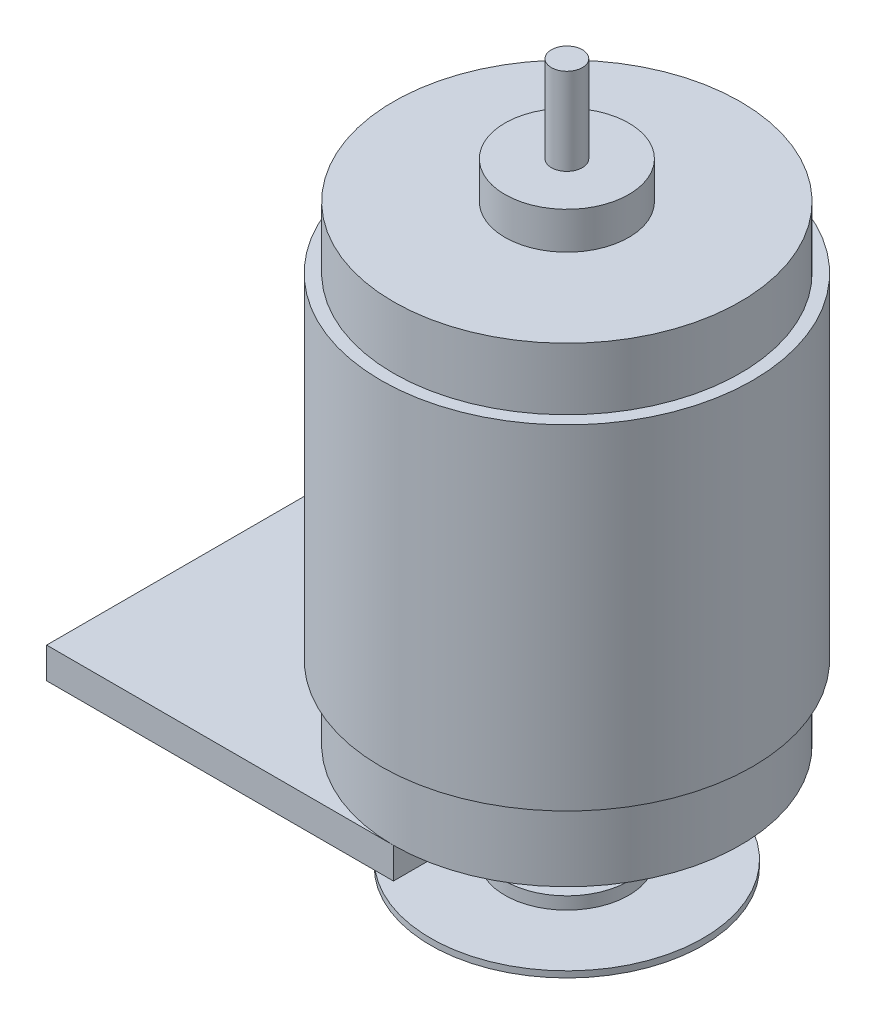
ISO-10303-21;
HEADER;
FILE_DESCRIPTION(('STEP AP214'),'2;1');
FILE_NAME('part.step','',(''),(''),'','','');
FILE_SCHEMA(('AUTOMOTIVE_DESIGN { 1 0 10303 214 1 1 1 1 }'));
ENDSEC;
DATA;
#1=APPLICATION_CONTEXT('core data for automotive mechanical design processes');
#2=APPLICATION_PROTOCOL_DEFINITION('international standard','automotive_design',2000,#1);
#3=PRODUCT_CONTEXT('',#1,'mechanical');
#4=PRODUCT('Part','Part','',(#3));
#5=PRODUCT_RELATED_PRODUCT_CATEGORY('part','',(#4));
#6=PRODUCT_DEFINITION_FORMATION('','',#4);
#7=PRODUCT_DEFINITION_CONTEXT('part definition',#1,'design');
#8=PRODUCT_DEFINITION('design','',#6,#7);
#9=PRODUCT_DEFINITION_SHAPE('','',#8);
#10=(LENGTH_UNIT() NAMED_UNIT(*) SI_UNIT(.MILLI.,.METRE.));
#11=(NAMED_UNIT(*) PLANE_ANGLE_UNIT() SI_UNIT($,.RADIAN.));
#12=(NAMED_UNIT(*) SI_UNIT($,.STERADIAN.) SOLID_ANGLE_UNIT());
#13=UNCERTAINTY_MEASURE_WITH_UNIT(LENGTH_MEASURE(1.E-05),#10,'distance_accuracy_value','');
#14=(GEOMETRIC_REPRESENTATION_CONTEXT(3) GLOBAL_UNCERTAINTY_ASSIGNED_CONTEXT((#13)) GLOBAL_UNIT_ASSIGNED_CONTEXT((#10,
#11,#12)) REPRESENTATION_CONTEXT('',''));
#15=CARTESIAN_POINT('',(0.,0.,0.));
#16=DIRECTION('',(0.,0.,1.));
#17=DIRECTION('',(1.,0.,0.));
#18=AXIS2_PLACEMENT_3D('',#15,#16,#17);
#19=CARTESIAN_POINT('',(0.,-6.,0.));
#20=DIRECTION('',(0.,-1.,0.));
#21=DIRECTION('',(0.,0.,-1.));
#22=AXIS2_PLACEMENT_3D('',#19,#20,#21);
#23=PLANE('',#22);
#24=CARTESIAN_POINT('',(0.,-6.,0.));
#25=DIRECTION('',(0.,-1.,0.));
#26=DIRECTION('',(0.,0.,-1.));
#27=AXIS2_PLACEMENT_3D('',#24,#25,#26);
#28=CIRCLE('',#27,14.);
#29=CARTESIAN_POINT('',(0.,-6.,-14.));
#30=VERTEX_POINT('',#29);
#31=CARTESIAN_POINT('',(0.,-6.,14.));
#32=VERTEX_POINT('',#31);
#33=EDGE_CURVE('E139',#30,#32,#28,.T.);
#34=ORIENTED_EDGE('',*,*,#33,.T.);
#35=DIRECTION('',(0.,0.,1.));
#36=VECTOR('',#35,1.);
#37=CARTESIAN_POINT('',(0.,-6.,14.));
#38=LINE('',#37,#36);
#39=CARTESIAN_POINT('',(0.,-6.,5.));
#40=VERTEX_POINT('',#39);
#41=EDGE_CURVE('E128',#40,#32,#38,.T.);
#42=ORIENTED_EDGE('',*,*,#41,.F.);
#43=CARTESIAN_POINT('',(0.,-6.,0.));
#44=DIRECTION('',(0.,-1.,0.));
#45=DIRECTION('',(0.,0.,-1.));
#46=AXIS2_PLACEMENT_3D('',#43,#44,#45);
#47=CIRCLE('',#46,5.);
#48=CARTESIAN_POINT('',(0.,-6.,-5.));
#49=VERTEX_POINT('',#48);
#50=EDGE_CURVE('E140',#49,#40,#47,.T.);
#51=ORIENTED_EDGE('',*,*,#50,.F.);
#52=EDGE_CURVE('E71',#30,#49,#38,.T.);
#53=ORIENTED_EDGE('',*,*,#52,.F.);
#54=EDGE_LOOP('',(#34,#42,#51,#53));
#55=FACE_BOUND('',#54,.T.);
#56=ADVANCED_FACE('F48',(#55),#23,.T.);
#57=CARTESIAN_POINT('',(0.,-9.,0.));
#58=DIRECTION('',(0.,1.,0.));
#59=DIRECTION('',(0.,0.,1.));
#60=AXIS2_PLACEMENT_3D('',#57,#58,#59);
#61=CYLINDRICAL_SURFACE('',#60,5.);
#62=CARTESIAN_POINT('',(0.,-9.,0.));
#63=DIRECTION('',(0.,-1.,0.));
#64=DIRECTION('',(0.,0.,-1.));
#65=AXIS2_PLACEMENT_3D('',#62,#63,#64);
#66=CIRCLE('',#65,5.);
#67=CARTESIAN_POINT('',(0.,-9.,-5.));
#68=VERTEX_POINT('',#67);
#69=EDGE_CURVE('E131',#68,#68,#66,.T.);
#70=ORIENTED_EDGE('',*,*,#69,.F.);
#71=EDGE_LOOP('',(#70));
#72=FACE_BOUND('',#71,.T.);
#73=DIRECTION('',(0.,1.,0.));
#74=VECTOR('',#73,1.);
#75=CARTESIAN_POINT('',(0.,-9.,5.));
#76=LINE('',#75,#74);
#77=CARTESIAN_POINT('',(0.,-8.5,5.));
#78=VERTEX_POINT('',#77);
#79=EDGE_CURVE('E52',#78,#40,#76,.T.);
#80=ORIENTED_EDGE('',*,*,#79,.F.);
#81=CARTESIAN_POINT('',(0.,-8.5,0.));
#82=DIRECTION('',(0.,1.,0.));
#83=DIRECTION('',(0.,0.,1.));
#84=AXIS2_PLACEMENT_3D('',#81,#82,#83);
#85=CIRCLE('',#84,5.);
#86=CARTESIAN_POINT('',(0.,-8.5,-5.));
#87=VERTEX_POINT('',#86);
#88=EDGE_CURVE('E110',#87,#78,#85,.T.);
#89=ORIENTED_EDGE('',*,*,#88,.F.);
#90=DIRECTION('',(0.,1.,0.));
#91=VECTOR('',#90,1.);
#92=CARTESIAN_POINT('',(0.,-9.,-5.));
#93=LINE('',#92,#91);
#94=EDGE_CURVE('E171',#49,#87,#93,.F.);
#95=ORIENTED_EDGE('',*,*,#94,.F.);
#96=ORIENTED_EDGE('',*,*,#50,.T.);
#97=EDGE_LOOP('',(#80,#89,#95,#96));
#98=FACE_BOUND('',#97,.T.);
#99=ADVANCED_FACE('F221',(#72,#98),#61,.T.);
#100=CARTESIAN_POINT('',(0.,27.,0.));
#101=DIRECTION('',(0.,-1.,0.));
#102=DIRECTION('',(0.,0.,-1.));
#103=AXIS2_PLACEMENT_3D('',#100,#101,#102);
#104=CYLINDRICAL_SURFACE('',#103,15.);
#105=CARTESIAN_POINT('',(0.,27.,0.));
#106=DIRECTION('',(0.,1.,0.));
#107=DIRECTION('',(0.,0.,1.));
#108=AXIS2_PLACEMENT_3D('',#105,#106,#107);
#109=CIRCLE('',#108,15.);
#110=CARTESIAN_POINT('',(0.,27.,15.));
#111=VERTEX_POINT('',#110);
#112=EDGE_CURVE('E166',#111,#111,#109,.T.);
#113=ORIENTED_EDGE('',*,*,#112,.F.);
#114=EDGE_LOOP('',(#113));
#115=FACE_BOUND('',#114,.T.);
#116=CARTESIAN_POINT('',(0.,0.,0.));
#117=DIRECTION('',(0.,1.,0.));
#118=DIRECTION('',(0.,0.,1.));
#119=AXIS2_PLACEMENT_3D('',#116,#117,#118);
#120=CIRCLE('',#119,15.);
#121=CARTESIAN_POINT('',(0.,0.,15.));
#122=VERTEX_POINT('',#121);
#123=EDGE_CURVE('E163',#122,#122,#120,.T.);
#124=ORIENTED_EDGE('',*,*,#123,.T.);
#125=EDGE_LOOP('',(#124));
#126=FACE_BOUND('',#125,.T.);
#127=ADVANCED_FACE('F50',(#115,#126),#104,.T.);
#128=CARTESIAN_POINT('',(0.,27.,0.));
#129=DIRECTION('',(0.,1.,0.));
#130=DIRECTION('',(0.,0.,1.));
#131=AXIS2_PLACEMENT_3D('',#128,#129,#130);
#132=PLANE('',#131);
#133=CARTESIAN_POINT('',(0.,27.,0.));
#134=DIRECTION('',(0.,1.,0.));
#135=DIRECTION('',(0.,0.,1.));
#136=AXIS2_PLACEMENT_3D('',#133,#134,#135);
#137=CIRCLE('',#136,14.);
#138=CARTESIAN_POINT('',(0.,27.,14.));
#139=VERTEX_POINT('',#138);
#140=EDGE_CURVE('E160',#139,#139,#137,.T.);
#141=ORIENTED_EDGE('',*,*,#140,.F.);
#142=EDGE_LOOP('',(#141));
#143=FACE_BOUND('',#142,.T.);
#144=ORIENTED_EDGE('',*,*,#112,.T.);
#145=EDGE_LOOP('',(#144));
#146=FACE_BOUND('',#145,.T.);
#147=ADVANCED_FACE('F257',(#143,#146),#132,.T.);
#148=CARTESIAN_POINT('',(0.,0.,0.));
#149=DIRECTION('',(0.,1.,0.));
#150=DIRECTION('',(0.,0.,1.));
#151=AXIS2_PLACEMENT_3D('',#148,#149,#150);
#152=PLANE('',#151);
#153=CARTESIAN_POINT('',(0.,0.,0.));
#154=DIRECTION('',(0.,-1.,0.));
#155=DIRECTION('',(0.,0.,-1.));
#156=AXIS2_PLACEMENT_3D('',#153,#154,#155);
#157=CIRCLE('',#156,14.);
#158=CARTESIAN_POINT('',(0.,0.,-14.));
#159=VERTEX_POINT('',#158);
#160=EDGE_CURVE('E143',#159,#159,#157,.T.);
#161=ORIENTED_EDGE('',*,*,#160,.F.);
#162=EDGE_LOOP('',(#161));
#163=FACE_BOUND('',#162,.T.);
#164=ORIENTED_EDGE('',*,*,#123,.F.);
#165=EDGE_LOOP('',(#164));
#166=FACE_BOUND('',#165,.T.);
#167=ADVANCED_FACE('F255',(#163,#166),#152,.F.);
#168=CARTESIAN_POINT('',(0.,32.,0.));
#169=DIRECTION('',(0.,-1.,0.));
#170=DIRECTION('',(0.,0.,-1.));
#171=AXIS2_PLACEMENT_3D('',#168,#169,#170);
#172=CYLINDRICAL_SURFACE('',#171,14.);
#173=CARTESIAN_POINT('',(0.,32.,0.));
#174=DIRECTION('',(0.,1.,0.));
#175=DIRECTION('',(0.,0.,1.));
#176=AXIS2_PLACEMENT_3D('',#173,#174,#175);
#177=CIRCLE('',#176,14.);
#178=CARTESIAN_POINT('',(0.,32.,14.));
#179=VERTEX_POINT('',#178);
#180=EDGE_CURVE('E157',#179,#179,#177,.T.);
#181=ORIENTED_EDGE('',*,*,#180,.F.);
#182=EDGE_LOOP('',(#181));
#183=FACE_BOUND('',#182,.T.);
#184=ORIENTED_EDGE('',*,*,#140,.T.);
#185=EDGE_LOOP('',(#184));
#186=FACE_BOUND('',#185,.T.);
#187=ADVANCED_FACE('F251',(#183,#186),#172,.T.);
#188=CARTESIAN_POINT('',(0.,32.,0.));
#189=DIRECTION('',(0.,1.,0.));
#190=DIRECTION('',(0.,0.,1.));
#191=AXIS2_PLACEMENT_3D('',#188,#189,#190);
#192=PLANE('',#191);
#193=CARTESIAN_POINT('',(0.,32.,0.));
#194=DIRECTION('',(0.,1.,0.));
#195=DIRECTION('',(0.,0.,1.));
#196=AXIS2_PLACEMENT_3D('',#193,#194,#195);
#197=CIRCLE('',#196,5.);
#198=CARTESIAN_POINT('',(0.,32.,5.));
#199=VERTEX_POINT('',#198);
#200=EDGE_CURVE('E154',#199,#199,#197,.T.);
#201=ORIENTED_EDGE('',*,*,#200,.F.);
#202=EDGE_LOOP('',(#201));
#203=FACE_BOUND('',#202,.T.);
#204=ORIENTED_EDGE('',*,*,#180,.T.);
#205=EDGE_LOOP('',(#204));
#206=FACE_BOUND('',#205,.T.);
#207=ADVANCED_FACE('F247',(#203,#206),#192,.T.);
#208=CARTESIAN_POINT('',(0.,35.,0.));
#209=DIRECTION('',(0.,-1.,0.));
#210=DIRECTION('',(0.,0.,-1.));
#211=AXIS2_PLACEMENT_3D('',#208,#209,#210);
#212=CYLINDRICAL_SURFACE('',#211,5.);
#213=CARTESIAN_POINT('',(0.,35.,0.));
#214=DIRECTION('',(0.,1.,0.));
#215=DIRECTION('',(0.,0.,1.));
#216=AXIS2_PLACEMENT_3D('',#213,#214,#215);
#217=CIRCLE('',#216,5.);
#218=CARTESIAN_POINT('',(0.,35.,5.));
#219=VERTEX_POINT('',#218);
#220=EDGE_CURVE('E151',#219,#219,#217,.T.);
#221=ORIENTED_EDGE('',*,*,#220,.F.);
#222=EDGE_LOOP('',(#221));
#223=FACE_BOUND('',#222,.T.);
#224=ORIENTED_EDGE('',*,*,#200,.T.);
#225=EDGE_LOOP('',(#224));
#226=FACE_BOUND('',#225,.T.);
#227=ADVANCED_FACE('F243',(#223,#226),#212,.T.);
#228=CARTESIAN_POINT('',(0.,35.,0.));
#229=DIRECTION('',(0.,1.,0.));
#230=DIRECTION('',(0.,0.,1.));
#231=AXIS2_PLACEMENT_3D('',#228,#229,#230);
#232=PLANE('',#231);
#233=CARTESIAN_POINT('',(0.,35.,0.));
#234=DIRECTION('',(0.,1.,0.));
#235=DIRECTION('',(0.,0.,1.));
#236=AXIS2_PLACEMENT_3D('',#233,#234,#235);
#237=CIRCLE('',#236,1.25);
#238=CARTESIAN_POINT('',(0.,35.,1.25));
#239=VERTEX_POINT('',#238);
#240=EDGE_CURVE('E148',#239,#239,#237,.T.);
#241=ORIENTED_EDGE('',*,*,#240,.F.);
#242=EDGE_LOOP('',(#241));
#243=FACE_BOUND('',#242,.T.);
#244=ORIENTED_EDGE('',*,*,#220,.T.);
#245=EDGE_LOOP('',(#244));
#246=FACE_BOUND('',#245,.T.);
#247=ADVANCED_FACE('F239',(#243,#246),#232,.T.);
#248=CARTESIAN_POINT('',(0.,42.,0.));
#249=DIRECTION('',(0.,-1.,0.));
#250=DIRECTION('',(0.,0.,-1.));
#251=AXIS2_PLACEMENT_3D('',#248,#249,#250);
#252=CYLINDRICAL_SURFACE('',#251,1.25);
#253=CARTESIAN_POINT('',(0.,42.,0.));
#254=DIRECTION('',(0.,1.,0.));
#255=DIRECTION('',(0.,0.,1.));
#256=AXIS2_PLACEMENT_3D('',#253,#254,#255);
#257=CIRCLE('',#256,1.25);
#258=CARTESIAN_POINT('',(0.,42.,1.25));
#259=VERTEX_POINT('',#258);
#260=EDGE_CURVE('E145',#259,#259,#257,.T.);
#261=ORIENTED_EDGE('',*,*,#260,.F.);
#262=EDGE_LOOP('',(#261));
#263=FACE_BOUND('',#262,.T.);
#264=ORIENTED_EDGE('',*,*,#240,.T.);
#265=EDGE_LOOP('',(#264));
#266=FACE_BOUND('',#265,.T.);
#267=ADVANCED_FACE('F235',(#263,#266),#252,.T.);
#268=CARTESIAN_POINT('',(0.,42.,0.));
#269=DIRECTION('',(0.,1.,0.));
#270=DIRECTION('',(0.,0.,1.));
#271=AXIS2_PLACEMENT_3D('',#268,#269,#270);
#272=PLANE('',#271);
#273=ORIENTED_EDGE('',*,*,#260,.T.);
#274=EDGE_LOOP('',(#273));
#275=FACE_BOUND('',#274,.T.);
#276=ADVANCED_FACE('F232',(#275),#272,.T.);
#277=CARTESIAN_POINT('',(0.,-6.,0.));
#278=DIRECTION('',(0.,1.,0.));
#279=DIRECTION('',(0.,0.,1.));
#280=AXIS2_PLACEMENT_3D('',#277,#278,#279);
#281=CYLINDRICAL_SURFACE('',#280,14.);
#282=ORIENTED_EDGE('',*,*,#33,.F.);
#283=CARTESIAN_POINT('',(0.,-6.,0.));
#284=DIRECTION('',(0.,1.,0.));
#285=DIRECTION('',(0.,0.,1.));
#286=AXIS2_PLACEMENT_3D('',#283,#284,#285);
#287=CIRCLE('',#286,14.);
#288=EDGE_CURVE('E64',#30,#32,#287,.T.);
#289=ORIENTED_EDGE('',*,*,#288,.T.);
#290=EDGE_LOOP('',(#282,#289));
#291=FACE_BOUND('',#290,.T.);
#292=ORIENTED_EDGE('',*,*,#160,.T.);
#293=EDGE_LOOP('',(#292));
#294=FACE_BOUND('',#293,.T.);
#295=ADVANCED_FACE('F229',(#291,#294),#281,.T.);
#296=CARTESIAN_POINT('',(0.,-9.,0.));
#297=DIRECTION('',(0.,-1.,0.));
#298=DIRECTION('',(0.,0.,-1.));
#299=AXIS2_PLACEMENT_3D('',#296,#297,#298);
#300=PLANE('',#299);
#301=CARTESIAN_POINT('',(0.,-9.,0.));
#302=DIRECTION('',(0.,-1.,0.));
#303=DIRECTION('',(0.,0.,-1.));
#304=AXIS2_PLACEMENT_3D('',#301,#302,#303);
#305=CIRCLE('',#304,1.25);
#306=CARTESIAN_POINT('',(0.,-9.,-1.25));
#307=VERTEX_POINT('',#306);
#308=EDGE_CURVE('E175',#307,#307,#305,.T.);
#309=ORIENTED_EDGE('',*,*,#308,.F.);
#310=EDGE_LOOP('',(#309));
#311=FACE_BOUND('',#310,.T.);
#312=ORIENTED_EDGE('',*,*,#69,.T.);
#313=EDGE_LOOP('',(#312));
#314=FACE_BOUND('',#313,.T.);
#315=ADVANCED_FACE('F218',(#311,#314),#300,.T.);
#316=CARTESIAN_POINT('',(0.,-8.5,14.));
#317=DIRECTION('',(-1.,0.,0.));
#318=DIRECTION('',(0.,0.,1.));
#319=AXIS2_PLACEMENT_3D('',#316,#317,#318);
#320=PLANE('',#319);
#321=DIRECTION('',(0.,0.,1.));
#322=VECTOR('',#321,1.);
#323=CARTESIAN_POINT('',(0.,-8.5,14.));
#324=LINE('',#323,#322);
#325=CARTESIAN_POINT('',(0.,-8.5,14.));
#326=VERTEX_POINT('',#325);
#327=EDGE_CURVE('E104',#78,#326,#324,.T.);
#328=ORIENTED_EDGE('',*,*,#327,.F.);
#329=ORIENTED_EDGE('',*,*,#79,.T.);
#330=ORIENTED_EDGE('',*,*,#41,.T.);
#331=DIRECTION('',(0.,1.,0.));
#332=VECTOR('',#331,1.);
#333=CARTESIAN_POINT('',(0.,-8.5,14.));
#334=LINE('',#333,#332);
#335=EDGE_CURVE('E120',#326,#32,#334,.T.);
#336=ORIENTED_EDGE('',*,*,#335,.F.);
#337=EDGE_LOOP('',(#328,#329,#330,#336));
#338=FACE_BOUND('',#337,.T.);
#339=ADVANCED_FACE('F127',(#338),#320,.F.);
#340=ORIENTED_EDGE('',*,*,#52,.T.);
#341=ORIENTED_EDGE('',*,*,#94,.T.);
#342=CARTESIAN_POINT('',(0.,-8.5,-14.));
#343=VERTEX_POINT('',#342);
#344=EDGE_CURVE('E114',#343,#87,#324,.T.);
#345=ORIENTED_EDGE('',*,*,#344,.F.);
#346=DIRECTION('',(0.,1.,0.));
#347=VECTOR('',#346,1.);
#348=CARTESIAN_POINT('',(0.,-8.5,-14.));
#349=LINE('',#348,#347);
#350=EDGE_CURVE('E189',#343,#30,#349,.T.);
#351=ORIENTED_EDGE('',*,*,#350,.T.);
#352=EDGE_LOOP('',(#340,#341,#345,#351));
#353=FACE_BOUND('',#352,.T.);
#354=ADVANCED_FACE('F210',(#353),#320,.F.);
#355=CARTESIAN_POINT('',(0.,-8.5,14.));
#356=DIRECTION('',(0.,0.,-1.));
#357=DIRECTION('',(-1.,0.,0.));
#358=AXIS2_PLACEMENT_3D('',#355,#356,#357);
#359=PLANE('',#358);
#360=DIRECTION('',(-1.,0.,0.));
#361=VECTOR('',#360,1.);
#362=CARTESIAN_POINT('',(0.,-6.,14.));
#363=LINE('',#362,#361);
#364=CARTESIAN_POINT('',(-28.,-6.,14.));
#365=VERTEX_POINT('',#364);
#366=EDGE_CURVE('E191',#32,#365,#363,.T.);
#367=ORIENTED_EDGE('',*,*,#366,.T.);
#368=DIRECTION('',(0.,1.,0.));
#369=VECTOR('',#368,1.);
#370=CARTESIAN_POINT('',(-28.,-8.5,14.));
#371=LINE('',#370,#369);
#372=CARTESIAN_POINT('',(-28.,-8.5,14.));
#373=VERTEX_POINT('',#372);
#374=EDGE_CURVE('E122',#373,#365,#371,.T.);
#375=ORIENTED_EDGE('',*,*,#374,.F.);
#376=DIRECTION('',(-1.,0.,0.));
#377=VECTOR('',#376,1.);
#378=CARTESIAN_POINT('',(0.,-8.5,14.));
#379=LINE('',#378,#377);
#380=EDGE_CURVE('E108',#326,#373,#379,.T.);
#381=ORIENTED_EDGE('',*,*,#380,.F.);
#382=ORIENTED_EDGE('',*,*,#335,.T.);
#383=EDGE_LOOP('',(#367,#375,#381,#382));
#384=FACE_BOUND('',#383,.T.);
#385=ADVANCED_FACE('F119',(#384),#359,.F.);
#386=CARTESIAN_POINT('',(-28.,-8.5,14.));
#387=DIRECTION('',(1.,0.,0.));
#388=DIRECTION('',(0.,0.,-1.));
#389=AXIS2_PLACEMENT_3D('',#386,#387,#388);
#390=PLANE('',#389);
#391=DIRECTION('',(0.,0.,-1.));
#392=VECTOR('',#391,1.);
#393=CARTESIAN_POINT('',(-28.,-6.,14.));
#394=LINE('',#393,#392);
#395=CARTESIAN_POINT('',(-28.,-6.,-14.));
#396=VERTEX_POINT('',#395);
#397=EDGE_CURVE('E193',#365,#396,#394,.T.);
#398=ORIENTED_EDGE('',*,*,#397,.T.);
#399=DIRECTION('',(0.,1.,0.));
#400=VECTOR('',#399,1.);
#401=CARTESIAN_POINT('',(-28.,-8.5,-14.));
#402=LINE('',#401,#400);
#403=CARTESIAN_POINT('',(-28.,-8.5,-14.));
#404=VERTEX_POINT('',#403);
#405=EDGE_CURVE('E133',#404,#396,#402,.T.);
#406=ORIENTED_EDGE('',*,*,#405,.F.);
#407=DIRECTION('',(0.,0.,-1.));
#408=VECTOR('',#407,1.);
#409=CARTESIAN_POINT('',(-28.,-8.5,14.));
#410=LINE('',#409,#408);
#411=EDGE_CURVE('E124',#373,#404,#410,.T.);
#412=ORIENTED_EDGE('',*,*,#411,.F.);
#413=ORIENTED_EDGE('',*,*,#374,.T.);
#414=EDGE_LOOP('',(#398,#406,#412,#413));
#415=FACE_BOUND('',#414,.T.);
#416=ADVANCED_FACE('F209',(#415),#390,.F.);
#417=CARTESIAN_POINT('',(0.,-8.5,-14.));
#418=DIRECTION('',(0.,0.,1.));
#419=DIRECTION('',(1.,0.,0.));
#420=AXIS2_PLACEMENT_3D('',#417,#418,#419);
#421=PLANE('',#420);
#422=DIRECTION('',(1.,0.,0.));
#423=VECTOR('',#422,1.);
#424=CARTESIAN_POINT('',(0.,-6.,-14.));
#425=LINE('',#424,#423);
#426=EDGE_CURVE('E115',#396,#30,#425,.T.);
#427=ORIENTED_EDGE('',*,*,#426,.T.);
#428=ORIENTED_EDGE('',*,*,#350,.F.);
#429=DIRECTION('',(1.,0.,0.));
#430=VECTOR('',#429,1.);
#431=CARTESIAN_POINT('',(0.,-8.5,-14.));
#432=LINE('',#431,#430);
#433=EDGE_CURVE('E187',#404,#343,#432,.T.);
#434=ORIENTED_EDGE('',*,*,#433,.F.);
#435=ORIENTED_EDGE('',*,*,#405,.T.);
#436=EDGE_LOOP('',(#427,#428,#434,#435));
#437=FACE_BOUND('',#436,.T.);
#438=ADVANCED_FACE('F203',(#437),#421,.F.);
#439=CARTESIAN_POINT('',(0.,-8.5,0.));
#440=DIRECTION('',(0.,1.,0.));
#441=DIRECTION('',(0.,0.,1.));
#442=AXIS2_PLACEMENT_3D('',#439,#440,#441);
#443=PLANE('',#442);
#444=ORIENTED_EDGE('',*,*,#344,.T.);
#445=ORIENTED_EDGE('',*,*,#88,.T.);
#446=ORIENTED_EDGE('',*,*,#327,.T.);
#447=ORIENTED_EDGE('',*,*,#380,.T.);
#448=ORIENTED_EDGE('',*,*,#411,.T.);
#449=ORIENTED_EDGE('',*,*,#433,.T.);
#450=EDGE_LOOP('',(#444,#445,#446,#447,#448,#449));
#451=FACE_BOUND('',#450,.T.);
#452=ADVANCED_FACE('F107',(#451),#443,.F.);
#453=CARTESIAN_POINT('',(0.,-6.,0.));
#454=DIRECTION('',(0.,1.,0.));
#455=DIRECTION('',(0.,0.,1.));
#456=AXIS2_PLACEMENT_3D('',#453,#454,#455);
#457=PLANE('',#456);
#458=ORIENTED_EDGE('',*,*,#288,.F.);
#459=ORIENTED_EDGE('',*,*,#426,.F.);
#460=ORIENTED_EDGE('',*,*,#397,.F.);
#461=ORIENTED_EDGE('',*,*,#366,.F.);
#462=EDGE_LOOP('',(#458,#459,#460,#461));
#463=FACE_BOUND('',#462,.T.);
#464=ADVANCED_FACE('F208',(#463),#457,.T.);
#465=CARTESIAN_POINT('',(0.,-13.,0.));
#466=DIRECTION('',(0.,1.,0.));
#467=DIRECTION('',(0.,0.,1.));
#468=AXIS2_PLACEMENT_3D('',#465,#466,#467);
#469=CYLINDRICAL_SURFACE('',#468,1.25);
#470=CARTESIAN_POINT('',(0.,-13.,0.));
#471=DIRECTION('',(0.,-1.,0.));
#472=DIRECTION('',(0.,0.,-1.));
#473=AXIS2_PLACEMENT_3D('',#470,#471,#472);
#474=CIRCLE('',#473,1.25);
#475=CARTESIAN_POINT('',(0.,-13.,-1.25));
#476=VERTEX_POINT('',#475);
#477=EDGE_CURVE('E183',#476,#476,#474,.T.);
#478=ORIENTED_EDGE('',*,*,#477,.F.);
#479=EDGE_LOOP('',(#478));
#480=FACE_BOUND('',#479,.T.);
#481=ORIENTED_EDGE('',*,*,#308,.T.);
#482=EDGE_LOOP('',(#481));
#483=FACE_BOUND('',#482,.T.);
#484=ADVANCED_FACE('F385',(#480,#483),#469,.T.);
#485=CARTESIAN_POINT('',(0.,-14.,0.));
#486=DIRECTION('',(0.,1.,0.));
#487=DIRECTION('',(0.,0.,1.));
#488=AXIS2_PLACEMENT_3D('',#485,#486,#487);
#489=CYLINDRICAL_SURFACE('',#488,5.);
#490=CARTESIAN_POINT('',(0.,-14.,0.));
#491=DIRECTION('',(0.,-1.,0.));
#492=DIRECTION('',(0.,0.,-1.));
#493=AXIS2_PLACEMENT_3D('',#490,#491,#492);
#494=CIRCLE('',#493,5.);
#495=CARTESIAN_POINT('',(0.,-14.,-5.));
#496=VERTEX_POINT('',#495);
#497=EDGE_CURVE('E509',#496,#496,#494,.T.);
#498=ORIENTED_EDGE('',*,*,#497,.F.);
#499=EDGE_LOOP('',(#498));
#500=FACE_BOUND('',#499,.T.);
#501=CARTESIAN_POINT('',(0.,-13.,0.));
#502=DIRECTION('',(0.,-1.,0.));
#503=DIRECTION('',(0.,0.,-1.));
#504=AXIS2_PLACEMENT_3D('',#501,#502,#503);
#505=CIRCLE('',#504,5.);
#506=CARTESIAN_POINT('',(0.,-13.,-5.));
#507=VERTEX_POINT('',#506);
#508=EDGE_CURVE('E506',#507,#507,#505,.T.);
#509=ORIENTED_EDGE('',*,*,#508,.T.);
#510=EDGE_LOOP('',(#509));
#511=FACE_BOUND('',#510,.T.);
#512=ADVANCED_FACE('F400',(#500,#511),#489,.T.);
#513=CARTESIAN_POINT('',(0.,-13.,0.));
#514=DIRECTION('',(0.,-1.,0.));
#515=DIRECTION('',(0.,0.,-1.));
#516=AXIS2_PLACEMENT_3D('',#513,#514,#515);
#517=PLANE('',#516);
#518=ORIENTED_EDGE('',*,*,#477,.T.);
#519=EDGE_LOOP('',(#518));
#520=FACE_BOUND('',#519,.T.);
#521=ORIENTED_EDGE('',*,*,#508,.F.);
#522=EDGE_LOOP('',(#521));
#523=FACE_BOUND('',#522,.T.);
#524=ADVANCED_FACE('F410',(#520,#523),#517,.F.);
#525=CARTESIAN_POINT('',(0.,-14.5,0.));
#526=DIRECTION('',(0.,1.,0.));
#527=DIRECTION('',(0.,0.,1.));
#528=AXIS2_PLACEMENT_3D('',#525,#526,#527);
#529=CYLINDRICAL_SURFACE('',#528,11.);
#530=CARTESIAN_POINT('',(0.,-14.5,0.));
#531=DIRECTION('',(0.,-1.,0.));
#532=DIRECTION('',(0.,0.,-1.));
#533=AXIS2_PLACEMENT_3D('',#530,#531,#532);
#534=CIRCLE('',#533,11.);
#535=CARTESIAN_POINT('',(0.,-14.5,-11.));
#536=VERTEX_POINT('',#535);
#537=EDGE_CURVE('E503',#536,#536,#534,.T.);
#538=ORIENTED_EDGE('',*,*,#537,.F.);
#539=EDGE_LOOP('',(#538));
#540=FACE_BOUND('',#539,.T.);
#541=CARTESIAN_POINT('',(0.,-14.,0.));
#542=DIRECTION('',(0.,-1.,0.));
#543=DIRECTION('',(0.,0.,-1.));
#544=AXIS2_PLACEMENT_3D('',#541,#542,#543);
#545=CIRCLE('',#544,11.);
#546=CARTESIAN_POINT('',(0.,-14.,-11.));
#547=VERTEX_POINT('',#546);
#548=EDGE_CURVE('E500',#547,#547,#545,.T.);
#549=ORIENTED_EDGE('',*,*,#548,.T.);
#550=EDGE_LOOP('',(#549));
#551=FACE_BOUND('',#550,.T.);
#552=ADVANCED_FACE('F420',(#540,#551),#529,.T.);
#553=CARTESIAN_POINT('',(0.,-14.5,0.));
#554=DIRECTION('',(0.,-1.,0.));
#555=DIRECTION('',(0.,0.,-1.));
#556=AXIS2_PLACEMENT_3D('',#553,#554,#555);
#557=PLANE('',#556);
#558=CARTESIAN_POINT('',(0.,-14.5,0.));
#559=DIRECTION('',(0.,-1.,0.));
#560=DIRECTION('',(0.,0.,-1.));
#561=AXIS2_PLACEMENT_3D('',#558,#559,#560);
#562=CIRCLE('',#561,5.);
#563=CARTESIAN_POINT('',(0.,-14.5,-5.));
#564=VERTEX_POINT('',#563);
#565=EDGE_CURVE('E57',#564,#564,#562,.T.);
#566=ORIENTED_EDGE('',*,*,#565,.F.);
#567=EDGE_LOOP('',(#566));
#568=FACE_BOUND('',#567,.T.);
#569=ORIENTED_EDGE('',*,*,#537,.T.);
#570=EDGE_LOOP('',(#569));
#571=FACE_BOUND('',#570,.T.);
#572=ADVANCED_FACE('F430',(#568,#571),#557,.T.);
#573=CARTESIAN_POINT('',(0.,-14.,0.));
#574=DIRECTION('',(0.,-1.,0.));
#575=DIRECTION('',(0.,0.,-1.));
#576=AXIS2_PLACEMENT_3D('',#573,#574,#575);
#577=PLANE('',#576);
#578=ORIENTED_EDGE('',*,*,#497,.T.);
#579=EDGE_LOOP('',(#578));
#580=FACE_BOUND('',#579,.T.);
#581=ORIENTED_EDGE('',*,*,#548,.F.);
#582=EDGE_LOOP('',(#581));
#583=FACE_BOUND('',#582,.T.);
#584=ADVANCED_FACE('F438',(#580,#583),#577,.F.);
#585=CARTESIAN_POINT('',(0.,-15.5,0.));
#586=DIRECTION('',(0.,1.,0.));
#587=DIRECTION('',(0.,0.,1.));
#588=AXIS2_PLACEMENT_3D('',#585,#586,#587);
#589=CYLINDRICAL_SURFACE('',#588,5.);
#590=CARTESIAN_POINT('',(0.,-15.5,0.));
#591=DIRECTION('',(0.,-1.,0.));
#592=DIRECTION('',(0.,0.,-1.));
#593=AXIS2_PLACEMENT_3D('',#590,#591,#592);
#594=CIRCLE('',#593,5.);
#595=CARTESIAN_POINT('',(0.,-15.5,-5.));
#596=VERTEX_POINT('',#595);
#597=EDGE_CURVE('E497',#596,#596,#594,.T.);
#598=ORIENTED_EDGE('',*,*,#597,.F.);
#599=EDGE_LOOP('',(#598));
#600=FACE_BOUND('',#599,.T.);
#601=ORIENTED_EDGE('',*,*,#565,.T.);
#602=EDGE_LOOP('',(#601));
#603=FACE_BOUND('',#602,.T.);
#604=ADVANCED_FACE('F443',(#600,#603),#589,.T.);
#605=CARTESIAN_POINT('',(0.,-15.5,0.));
#606=DIRECTION('',(0.,-1.,0.));
#607=DIRECTION('',(0.,0.,-1.));
#608=AXIS2_PLACEMENT_3D('',#605,#606,#607);
#609=PLANE('',#608);
#610=CARTESIAN_POINT('',(0.,-15.5,0.));
#611=DIRECTION('',(0.,-1.,0.));
#612=DIRECTION('',(0.,0.,-1.));
#613=AXIS2_PLACEMENT_3D('',#610,#611,#612);
#614=CIRCLE('',#613,1.25);
#615=CARTESIAN_POINT('',(0.,-15.5,-1.25));
#616=VERTEX_POINT('',#615);
#617=EDGE_CURVE('E13',#616,#616,#614,.T.);
#618=ORIENTED_EDGE('',*,*,#617,.F.);
#619=EDGE_LOOP('',(#618));
#620=FACE_BOUND('',#619,.T.);
#621=ORIENTED_EDGE('',*,*,#597,.T.);
#622=EDGE_LOOP('',(#621));
#623=FACE_BOUND('',#622,.T.);
#624=ADVANCED_FACE('F460',(#620,#623),#609,.T.);
#625=CARTESIAN_POINT('',(0.,-18.5,0.));
#626=DIRECTION('',(0.,1.,0.));
#627=DIRECTION('',(0.,0.,1.));
#628=AXIS2_PLACEMENT_3D('',#625,#626,#627);
#629=CYLINDRICAL_SURFACE('',#628,1.25);
#630=CARTESIAN_POINT('',(0.,-18.5,0.));
#631=DIRECTION('',(0.,-1.,0.));
#632=DIRECTION('',(0.,0.,-1.));
#633=AXIS2_PLACEMENT_3D('',#630,#631,#632);
#634=CIRCLE('',#633,1.25);
#635=CARTESIAN_POINT('',(0.,-18.5,-1.25));
#636=VERTEX_POINT('',#635);
#637=EDGE_CURVE('E496',#636,#636,#634,.T.);
#638=ORIENTED_EDGE('',*,*,#637,.F.);
#639=EDGE_LOOP('',(#638));
#640=FACE_BOUND('',#639,.T.);
#641=ORIENTED_EDGE('',*,*,#617,.T.);
#642=EDGE_LOOP('',(#641));
#643=FACE_BOUND('',#642,.T.);
#644=ADVANCED_FACE('F470',(#640,#643),#629,.T.);
#645=CARTESIAN_POINT('',(0.,-18.5,0.));
#646=DIRECTION('',(0.,-1.,0.));
#647=DIRECTION('',(0.,0.,-1.));
#648=AXIS2_PLACEMENT_3D('',#645,#646,#647);
#649=PLANE('',#648);
#650=ORIENTED_EDGE('',*,*,#637,.T.);
#651=EDGE_LOOP('',(#650));
#652=FACE_BOUND('',#651,.T.);
#653=ADVANCED_FACE('F480',(#652),#649,.T.);
#654=CLOSED_SHELL('',(#56,#99,#127,#147,#167,#187,#207,#227,#247,#267,#276,#295,#315,#339,#354,
#385,#416,#438,#452,#464,#484,#512,#524,#552,#572,#584,#604,#624,#644,#653));
#655=MANIFOLD_SOLID_BREP('B2',#654);
#656=ADVANCED_BREP_SHAPE_REPRESENTATION('',(#18,#655),#14);
#657=SHAPE_DEFINITION_REPRESENTATION(#9,#656);
ENDSEC;
END-ISO-10303-21;
